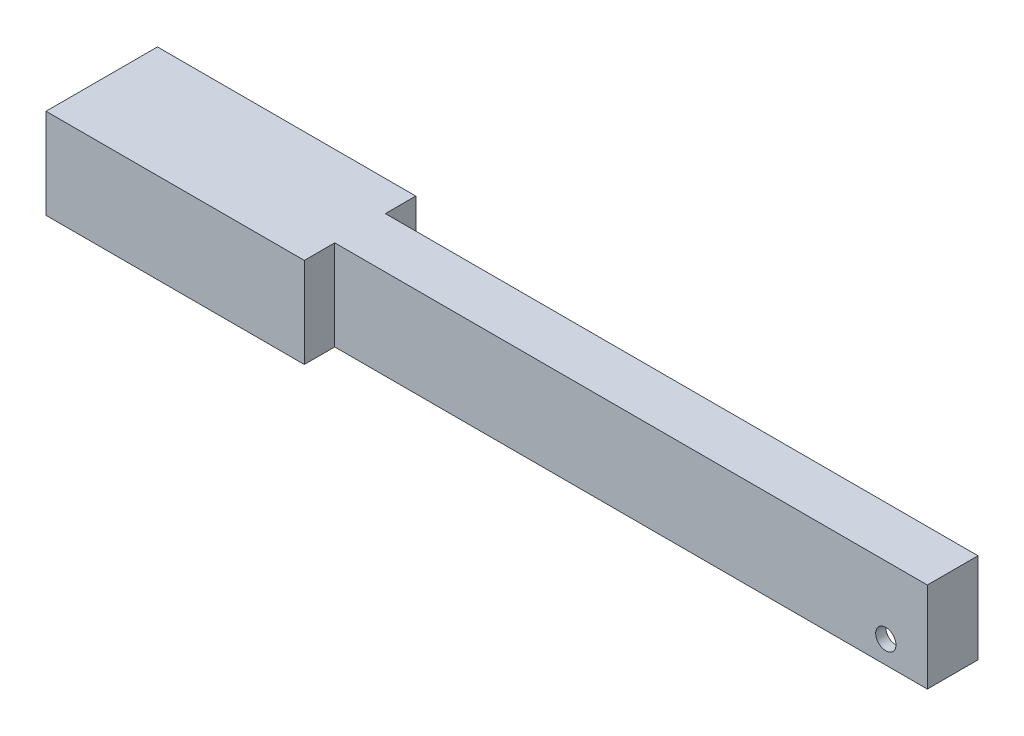
ISO-10303-21;
HEADER;
FILE_DESCRIPTION(('STEP AP214'),'2;1');
FILE_NAME('part.step','',(''),(''),'','','');
FILE_SCHEMA(('AUTOMOTIVE_DESIGN { 1 0 10303 214 1 1 1 1 }'));
ENDSEC;
DATA;
#1=APPLICATION_CONTEXT('core data for automotive mechanical design processes');
#2=APPLICATION_PROTOCOL_DEFINITION('international standard','automotive_design',2000,#1);
#3=PRODUCT_CONTEXT('',#1,'mechanical');
#4=PRODUCT('Part','Part','',(#3));
#5=PRODUCT_RELATED_PRODUCT_CATEGORY('part','',(#4));
#6=PRODUCT_DEFINITION_FORMATION('','',#4);
#7=PRODUCT_DEFINITION_CONTEXT('part definition',#1,'design');
#8=PRODUCT_DEFINITION('design','',#6,#7);
#9=PRODUCT_DEFINITION_SHAPE('','',#8);
#10=(LENGTH_UNIT() NAMED_UNIT(*) SI_UNIT(.MILLI.,.METRE.));
#11=(NAMED_UNIT(*) PLANE_ANGLE_UNIT() SI_UNIT($,.RADIAN.));
#12=(NAMED_UNIT(*) SI_UNIT($,.STERADIAN.) SOLID_ANGLE_UNIT());
#13=UNCERTAINTY_MEASURE_WITH_UNIT(LENGTH_MEASURE(1.E-05),#10,'distance_accuracy_value','');
#14=(GEOMETRIC_REPRESENTATION_CONTEXT(3) GLOBAL_UNCERTAINTY_ASSIGNED_CONTEXT((#13)) GLOBAL_UNIT_ASSIGNED_CONTEXT((#10,
#11,#12)) REPRESENTATION_CONTEXT('',''));
#15=CARTESIAN_POINT('',(0.,0.,0.));
#16=DIRECTION('',(0.,0.,1.));
#17=DIRECTION('',(1.,0.,0.));
#18=AXIS2_PLACEMENT_3D('',#15,#16,#17);
#19=CARTESIAN_POINT('',(-82.,164.984847789123,8.99999999999999));
#20=DIRECTION('',(-1.,0.,0.));
#21=DIRECTION('',(0.,0.,1.));
#22=AXIS2_PLACEMENT_3D('',#19,#20,#21);
#23=PLANE('',#22);
#24=DIRECTION('',(0.,0.,-1.));
#25=VECTOR('',#24,1.);
#26=CARTESIAN_POINT('',(-82.,-14.3,56.0425339453563));
#27=LINE('',#26,#25);
#28=CARTESIAN_POINT('',(-82.,-14.3,8.99999999999999));
#29=VERTEX_POINT('',#28);
#30=CARTESIAN_POINT('',(-82.,-14.3,-9.));
#31=VERTEX_POINT('',#30);
#32=EDGE_CURVE('E230',#29,#31,#27,.T.);
#33=ORIENTED_EDGE('',*,*,#32,.F.);
#34=DIRECTION('',(0.,-1.,0.));
#35=VECTOR('',#34,1.);
#36=CARTESIAN_POINT('',(-82.,164.984847789123,8.99999999999999));
#37=LINE('',#36,#35);
#38=CARTESIAN_POINT('',(-82.,-17.8,8.99999999999999));
#39=VERTEX_POINT('',#38);
#40=EDGE_CURVE('E272',#29,#39,#37,.T.);
#41=ORIENTED_EDGE('',*,*,#40,.T.);
#42=DIRECTION('',(0.,0.,-1.));
#43=VECTOR('',#42,1.);
#44=CARTESIAN_POINT('',(-82.,-17.8,8.99999999999999));
#45=LINE('',#44,#43);
#46=CARTESIAN_POINT('',(-82.,-17.8,-9.));
#47=VERTEX_POINT('',#46);
#48=EDGE_CURVE('E263',#39,#47,#45,.T.);
#49=ORIENTED_EDGE('',*,*,#48,.T.);
#50=DIRECTION('',(0.,-1.,0.));
#51=VECTOR('',#50,1.);
#52=CARTESIAN_POINT('',(-82.,164.984847789123,-9.));
#53=LINE('',#52,#51);
#54=EDGE_CURVE('E270',#31,#47,#53,.T.);
#55=ORIENTED_EDGE('',*,*,#54,.F.);
#56=EDGE_LOOP('',(#33,#41,#49,#55));
#57=FACE_BOUND('',#56,.T.);
#58=ADVANCED_FACE('F44',(#57),#23,.F.);
#59=DIRECTION('',(0.,0.,-1.));
#60=VECTOR('',#59,1.);
#61=CARTESIAN_POINT('',(-82.,-12.3,56.0425339453563));
#62=LINE('',#61,#60);
#63=CARTESIAN_POINT('',(-82.,-12.3,8.99999999999999));
#64=VERTEX_POINT('',#63);
#65=CARTESIAN_POINT('',(-82.,-12.3,-9.));
#66=VERTEX_POINT('',#65);
#67=EDGE_CURVE('E69',#64,#66,#62,.T.);
#68=ORIENTED_EDGE('',*,*,#67,.T.);
#69=CARTESIAN_POINT('',(-82.,-2.,-9.));
#70=VERTEX_POINT('',#69);
#71=EDGE_CURVE('E296',#70,#66,#53,.T.);
#72=ORIENTED_EDGE('',*,*,#71,.F.);
#73=DIRECTION('',(0.,0.,-1.));
#74=VECTOR('',#73,1.);
#75=CARTESIAN_POINT('',(-82.,-2.,8.99999999999999));
#76=LINE('',#75,#74);
#77=CARTESIAN_POINT('',(-82.,-2.,8.99999999999999));
#78=VERTEX_POINT('',#77);
#79=EDGE_CURVE('E247',#78,#70,#76,.T.);
#80=ORIENTED_EDGE('',*,*,#79,.F.);
#81=EDGE_CURVE('E306',#78,#64,#37,.T.);
#82=ORIENTED_EDGE('',*,*,#81,.T.);
#83=EDGE_LOOP('',(#68,#72,#80,#82));
#84=FACE_BOUND('',#83,.T.);
#85=ADVANCED_FACE('F397',(#84),#23,.F.);
#86=CARTESIAN_POINT('',(-82.,164.984847789123,-9.));
#87=DIRECTION('',(0.,0.,-1.));
#88=DIRECTION('',(-1.,0.,0.));
#89=AXIS2_PLACEMENT_3D('',#86,#87,#88);
#90=PLANE('',#89);
#91=DIRECTION('',(1.,0.,0.));
#92=VECTOR('',#91,1.);
#93=CARTESIAN_POINT('',(-82.,-14.3,-9.));
#94=LINE('',#93,#92);
#95=CARTESIAN_POINT('',(-35.,-14.3,-9.));
#96=VERTEX_POINT('',#95);
#97=EDGE_CURVE('E61',#31,#96,#94,.T.);
#98=ORIENTED_EDGE('',*,*,#97,.F.);
#99=ORIENTED_EDGE('',*,*,#54,.T.);
#100=DIRECTION('',(1.,0.,0.));
#101=VECTOR('',#100,1.);
#102=CARTESIAN_POINT('',(-82.,-17.8,-9.));
#103=LINE('',#102,#101);
#104=CARTESIAN_POINT('',(-35.,-17.8,-9.));
#105=VERTEX_POINT('',#104);
#106=EDGE_CURVE('E260',#47,#105,#103,.T.);
#107=ORIENTED_EDGE('',*,*,#106,.T.);
#108=DIRECTION('',(0.,-1.,0.));
#109=VECTOR('',#108,1.);
#110=CARTESIAN_POINT('',(-35.,164.984847789123,-9.));
#111=LINE('',#110,#109);
#112=EDGE_CURVE('E295',#96,#105,#111,.T.);
#113=ORIENTED_EDGE('',*,*,#112,.F.);
#114=EDGE_LOOP('',(#98,#99,#107,#113));
#115=FACE_BOUND('',#114,.T.);
#116=ADVANCED_FACE('F403',(#115),#90,.F.);
#117=DIRECTION('',(-1.,0.,0.));
#118=VECTOR('',#117,1.);
#119=CARTESIAN_POINT('',(-82.,-12.3,-9.));
#120=LINE('',#119,#118);
#121=CARTESIAN_POINT('',(-35.,-12.3,-9.));
#122=VERTEX_POINT('',#121);
#123=EDGE_CURVE('E217',#122,#66,#120,.T.);
#124=ORIENTED_EDGE('',*,*,#123,.F.);
#125=CARTESIAN_POINT('',(-35.,-2.,-9.));
#126=VERTEX_POINT('',#125);
#127=EDGE_CURVE('E292',#126,#122,#111,.T.);
#128=ORIENTED_EDGE('',*,*,#127,.F.);
#129=DIRECTION('',(1.,0.,0.));
#130=VECTOR('',#129,1.);
#131=CARTESIAN_POINT('',(-82.,-2.,-9.));
#132=LINE('',#131,#130);
#133=EDGE_CURVE('E293',#70,#126,#132,.T.);
#134=ORIENTED_EDGE('',*,*,#133,.F.);
#135=ORIENTED_EDGE('',*,*,#71,.T.);
#136=EDGE_LOOP('',(#124,#128,#134,#135));
#137=FACE_BOUND('',#136,.T.);
#138=ADVANCED_FACE('F526',(#137),#90,.F.);
#139=CARTESIAN_POINT('',(-35.,164.984847789123,-9.));
#140=DIRECTION('',(1.,0.,0.));
#141=DIRECTION('',(0.,0.,-1.));
#142=AXIS2_PLACEMENT_3D('',#139,#140,#141);
#143=PLANE('',#142);
#144=DIRECTION('',(0.,0.,-1.));
#145=VECTOR('',#144,1.);
#146=CARTESIAN_POINT('',(-35.,-14.3,56.0425339453563));
#147=LINE('',#146,#145);
#148=CARTESIAN_POINT('',(-35.,-14.3,-3.));
#149=VERTEX_POINT('',#148);
#150=EDGE_CURVE('E235',#149,#96,#147,.T.);
#151=ORIENTED_EDGE('',*,*,#150,.T.);
#152=ORIENTED_EDGE('',*,*,#112,.T.);
#153=DIRECTION('',(0.,0.,1.));
#154=VECTOR('',#153,1.);
#155=CARTESIAN_POINT('',(-35.,-17.8,-9.));
#156=LINE('',#155,#154);
#157=CARTESIAN_POINT('',(-35.,-17.8,-3.));
#158=VERTEX_POINT('',#157);
#159=EDGE_CURVE('E257',#105,#158,#156,.T.);
#160=ORIENTED_EDGE('',*,*,#159,.T.);
#161=DIRECTION('',(0.,-1.,0.));
#162=VECTOR('',#161,1.);
#163=CARTESIAN_POINT('',(-35.,164.984847789123,-3.));
#164=LINE('',#163,#162);
#165=EDGE_CURVE('E291',#149,#158,#164,.T.);
#166=ORIENTED_EDGE('',*,*,#165,.F.);
#167=EDGE_LOOP('',(#151,#152,#160,#166));
#168=FACE_BOUND('',#167,.T.);
#169=ADVANCED_FACE('F521',(#168),#143,.F.);
#170=DIRECTION('',(0.,0.,-1.));
#171=VECTOR('',#170,1.);
#172=CARTESIAN_POINT('',(-35.,-12.3,56.0425339453563));
#173=LINE('',#172,#171);
#174=CARTESIAN_POINT('',(-35.,-12.3,-3.));
#175=VERTEX_POINT('',#174);
#176=EDGE_CURVE('E220',#175,#122,#173,.T.);
#177=ORIENTED_EDGE('',*,*,#176,.F.);
#178=CARTESIAN_POINT('',(-35.,-2.,-3.));
#179=VERTEX_POINT('',#178);
#180=EDGE_CURVE('E287',#179,#175,#164,.T.);
#181=ORIENTED_EDGE('',*,*,#180,.F.);
#182=DIRECTION('',(0.,0.,1.));
#183=VECTOR('',#182,1.);
#184=CARTESIAN_POINT('',(-35.,-2.,-9.));
#185=LINE('',#184,#183);
#186=EDGE_CURVE('E288',#126,#179,#185,.T.);
#187=ORIENTED_EDGE('',*,*,#186,.F.);
#188=ORIENTED_EDGE('',*,*,#127,.T.);
#189=EDGE_LOOP('',(#177,#181,#187,#188));
#190=FACE_BOUND('',#189,.T.);
#191=ADVANCED_FACE('F489',(#190),#143,.F.);
#192=CARTESIAN_POINT('',(-35.,164.984847789123,8.99999999999999));
#193=DIRECTION('',(1.,0.,0.));
#194=DIRECTION('',(0.,0.,-1.));
#195=AXIS2_PLACEMENT_3D('',#192,#193,#194);
#196=PLANE('',#195);
#197=CARTESIAN_POINT('',(-35.,-14.3,8.99999999999999));
#198=VERTEX_POINT('',#197);
#199=CARTESIAN_POINT('',(-35.,-14.3,3.));
#200=VERTEX_POINT('',#199);
#201=EDGE_CURVE('E233',#198,#200,#147,.T.);
#202=ORIENTED_EDGE('',*,*,#201,.T.);
#203=DIRECTION('',(0.,-1.,0.));
#204=VECTOR('',#203,1.);
#205=CARTESIAN_POINT('',(-35.,164.984847789123,3.));
#206=LINE('',#205,#204);
#207=CARTESIAN_POINT('',(-35.,-17.8,3.));
#208=VERTEX_POINT('',#207);
#209=EDGE_CURVE('E278',#200,#208,#206,.T.);
#210=ORIENTED_EDGE('',*,*,#209,.T.);
#211=DIRECTION('',(0.,0.,1.));
#212=VECTOR('',#211,1.);
#213=CARTESIAN_POINT('',(-35.,-17.8,8.99999999999999));
#214=LINE('',#213,#212);
#215=CARTESIAN_POINT('',(-35.,-17.8,8.99999999999999));
#216=VERTEX_POINT('',#215);
#217=EDGE_CURVE('E244',#208,#216,#214,.T.);
#218=ORIENTED_EDGE('',*,*,#217,.T.);
#219=DIRECTION('',(0.,-1.,0.));
#220=VECTOR('',#219,1.);
#221=CARTESIAN_POINT('',(-35.,164.984847789123,8.99999999999999));
#222=LINE('',#221,#220);
#223=EDGE_CURVE('E206',#198,#216,#222,.T.);
#224=ORIENTED_EDGE('',*,*,#223,.F.);
#225=EDGE_LOOP('',(#202,#210,#218,#224));
#226=FACE_BOUND('',#225,.T.);
#227=ADVANCED_FACE('F487',(#226),#196,.F.);
#228=CARTESIAN_POINT('',(-35.,-12.3,8.99999999999999));
#229=VERTEX_POINT('',#228);
#230=CARTESIAN_POINT('',(-35.,-12.3,3.));
#231=VERTEX_POINT('',#230);
#232=EDGE_CURVE('E210',#229,#231,#173,.T.);
#233=ORIENTED_EDGE('',*,*,#232,.F.);
#234=CARTESIAN_POINT('',(-35.,-2.,8.99999999999999));
#235=VERTEX_POINT('',#234);
#236=EDGE_CURVE('E196',#235,#229,#222,.T.);
#237=ORIENTED_EDGE('',*,*,#236,.F.);
#238=DIRECTION('',(0.,0.,1.));
#239=VECTOR('',#238,1.);
#240=CARTESIAN_POINT('',(-35.,-2.,8.99999999999999));
#241=LINE('',#240,#239);
#242=CARTESIAN_POINT('',(-35.,-2.,3.));
#243=VERTEX_POINT('',#242);
#244=EDGE_CURVE('E273',#243,#235,#241,.T.);
#245=ORIENTED_EDGE('',*,*,#244,.F.);
#246=EDGE_CURVE('E213',#243,#231,#206,.T.);
#247=ORIENTED_EDGE('',*,*,#246,.T.);
#248=EDGE_LOOP('',(#233,#237,#245,#247));
#249=FACE_BOUND('',#248,.T.);
#250=ADVANCED_FACE('F211',(#249),#196,.F.);
#251=CARTESIAN_POINT('',(-35.,164.984847789123,8.99999999999999));
#252=DIRECTION('',(0.,0.,1.));
#253=DIRECTION('',(1.,0.,0.));
#254=AXIS2_PLACEMENT_3D('',#251,#252,#253);
#255=PLANE('',#254);
#256=DIRECTION('',(1.,0.,0.));
#257=VECTOR('',#256,1.);
#258=CARTESIAN_POINT('',(-82.,-14.3,8.99999999999999));
#259=LINE('',#258,#257);
#260=EDGE_CURVE('E223',#29,#198,#259,.T.);
#261=ORIENTED_EDGE('',*,*,#260,.T.);
#262=ORIENTED_EDGE('',*,*,#223,.T.);
#263=DIRECTION('',(-1.,0.,0.));
#264=VECTOR('',#263,1.);
#265=CARTESIAN_POINT('',(-35.,-17.8,8.99999999999999));
#266=LINE('',#265,#264);
#267=EDGE_CURVE('E243',#216,#39,#266,.T.);
#268=ORIENTED_EDGE('',*,*,#267,.T.);
#269=ORIENTED_EDGE('',*,*,#40,.F.);
#270=EDGE_LOOP('',(#261,#262,#268,#269));
#271=FACE_BOUND('',#270,.T.);
#272=ADVANCED_FACE('F477',(#271),#255,.F.);
#273=DIRECTION('',(-1.,0.,0.));
#274=VECTOR('',#273,1.);
#275=CARTESIAN_POINT('',(-82.,-12.3,8.99999999999999));
#276=LINE('',#275,#274);
#277=EDGE_CURVE('E201',#229,#64,#276,.T.);
#278=ORIENTED_EDGE('',*,*,#277,.T.);
#279=ORIENTED_EDGE('',*,*,#81,.F.);
#280=DIRECTION('',(-1.,0.,0.));
#281=VECTOR('',#280,1.);
#282=CARTESIAN_POINT('',(-35.,-2.,8.99999999999999));
#283=LINE('',#282,#281);
#284=EDGE_CURVE('E203',#235,#78,#283,.T.);
#285=ORIENTED_EDGE('',*,*,#284,.F.);
#286=ORIENTED_EDGE('',*,*,#236,.T.);
#287=EDGE_LOOP('',(#278,#279,#285,#286));
#288=FACE_BOUND('',#287,.T.);
#289=ADVANCED_FACE('F198',(#288),#255,.F.);
#290=CARTESIAN_POINT('',(75.8000000000001,-13.35,-16.6568542494924));
#291=DIRECTION('',(0.,0.,1.));
#292=DIRECTION('',(1.,0.,0.));
#293=AXIS2_PLACEMENT_3D('',#290,#291,#292);
#294=CYLINDRICAL_SURFACE('',#293,2.);
#295=CARTESIAN_POINT('',(75.8000000000001,-13.35,-3.));
#296=DIRECTION('',(0.,0.,-1.));
#297=DIRECTION('',(-1.,0.,0.));
#298=AXIS2_PLACEMENT_3D('',#295,#296,#297);
#299=CIRCLE('',#298,2.);
#300=CARTESIAN_POINT('',(73.8000000000001,-13.35,-3.));
#301=VERTEX_POINT('',#300);
#302=EDGE_CURVE('E48',#301,#301,#299,.F.);
#303=ORIENTED_EDGE('',*,*,#302,.T.);
#304=EDGE_LOOP('',(#303));
#305=FACE_BOUND('',#304,.T.);
#306=CARTESIAN_POINT('',(75.8000000000001,-13.35,-5.));
#307=DIRECTION('',(0.,0.,1.));
#308=DIRECTION('',(1.,0.,0.));
#309=AXIS2_PLACEMENT_3D('',#306,#307,#308);
#310=CIRCLE('',#309,2.);
#311=CARTESIAN_POINT('',(77.8000000000001,-13.35,-5.));
#312=VERTEX_POINT('',#311);
#313=EDGE_CURVE('E358',#312,#312,#310,.F.);
#314=ORIENTED_EDGE('',*,*,#313,.T.);
#315=EDGE_LOOP('',(#314));
#316=FACE_BOUND('',#315,.T.);
#317=ADVANCED_FACE('F376',(#305,#316),#294,.F.);
#318=CARTESIAN_POINT('',(-84.,-17.8,11.));
#319=DIRECTION('',(0.,0.,1.));
#320=DIRECTION('',(1.,0.,0.));
#321=AXIS2_PLACEMENT_3D('',#318,#319,#320);
#322=PLANE('',#321);
#323=DIRECTION('',(0.,1.,0.));
#324=VECTOR('',#323,1.);
#325=CARTESIAN_POINT('',(-33.,-134.9537451386,11.));
#326=LINE('',#325,#324);
#327=CARTESIAN_POINT('',(-33.,-17.8,11.));
#328=VERTEX_POINT('',#327);
#329=CARTESIAN_POINT('',(-33.,0.,11.));
#330=VERTEX_POINT('',#329);
#331=EDGE_CURVE('E335',#328,#330,#326,.T.);
#332=ORIENTED_EDGE('',*,*,#331,.T.);
#333=DIRECTION('',(1.,0.,0.));
#334=VECTOR('',#333,1.);
#335=CARTESIAN_POINT('',(-84.,0.,11.));
#336=LINE('',#335,#334);
#337=CARTESIAN_POINT('',(-84.,0.,11.));
#338=VERTEX_POINT('',#337);
#339=EDGE_CURVE('E354',#338,#330,#336,.T.);
#340=ORIENTED_EDGE('',*,*,#339,.F.);
#341=DIRECTION('',(0.,1.,0.));
#342=VECTOR('',#341,1.);
#343=CARTESIAN_POINT('',(-84.,-17.8,11.));
#344=LINE('',#343,#342);
#345=CARTESIAN_POINT('',(-84.,-17.8,11.));
#346=VERTEX_POINT('',#345);
#347=EDGE_CURVE('E12',#346,#338,#344,.T.);
#348=ORIENTED_EDGE('',*,*,#347,.F.);
#349=DIRECTION('',(1.,0.,0.));
#350=VECTOR('',#349,1.);
#351=CARTESIAN_POINT('',(-84.,-17.8,11.));
#352=LINE('',#351,#350);
#353=EDGE_CURVE('E342',#346,#328,#352,.T.);
#354=ORIENTED_EDGE('',*,*,#353,.T.);
#355=EDGE_LOOP('',(#332,#340,#348,#354));
#356=FACE_BOUND('',#355,.T.);
#357=ADVANCED_FACE('F46',(#356),#322,.T.);
#358=CARTESIAN_POINT('',(-84.,-17.8,11.));
#359=DIRECTION('',(1.,0.,0.));
#360=DIRECTION('',(0.,0.,-1.));
#361=AXIS2_PLACEMENT_3D('',#358,#359,#360);
#362=PLANE('',#361);
#363=DIRECTION('',(0.,0.,-1.));
#364=VECTOR('',#363,1.);
#365=CARTESIAN_POINT('',(-84.,0.,11.));
#366=LINE('',#365,#364);
#367=CARTESIAN_POINT('',(-84.,0.,-11.));
#368=VERTEX_POINT('',#367);
#369=EDGE_CURVE('E346',#338,#368,#366,.T.);
#370=ORIENTED_EDGE('',*,*,#369,.T.);
#371=DIRECTION('',(0.,1.,0.));
#372=VECTOR('',#371,1.);
#373=CARTESIAN_POINT('',(-84.,-17.8,-11.));
#374=LINE('',#373,#372);
#375=CARTESIAN_POINT('',(-84.,-17.8,-11.));
#376=VERTEX_POINT('',#375);
#377=EDGE_CURVE('E53',#376,#368,#374,.T.);
#378=ORIENTED_EDGE('',*,*,#377,.F.);
#379=DIRECTION('',(0.,0.,-1.));
#380=VECTOR('',#379,1.);
#381=CARTESIAN_POINT('',(-84.,-17.8,11.));
#382=LINE('',#381,#380);
#383=EDGE_CURVE('E352',#346,#376,#382,.T.);
#384=ORIENTED_EDGE('',*,*,#383,.F.);
#385=ORIENTED_EDGE('',*,*,#347,.T.);
#386=EDGE_LOOP('',(#370,#378,#384,#385));
#387=FACE_BOUND('',#386,.T.);
#388=ADVANCED_FACE('F434',(#387),#362,.F.);
#389=CARTESIAN_POINT('',(-84.,-17.8,-11.));
#390=DIRECTION('',(0.,0.,1.));
#391=DIRECTION('',(1.,0.,0.));
#392=AXIS2_PLACEMENT_3D('',#389,#390,#391);
#393=PLANE('',#392);
#394=DIRECTION('',(1.,0.,0.));
#395=VECTOR('',#394,1.);
#396=CARTESIAN_POINT('',(-84.,0.,-11.));
#397=LINE('',#396,#395);
#398=CARTESIAN_POINT('',(-33.,0.,-11.));
#399=VERTEX_POINT('',#398);
#400=EDGE_CURVE('E361',#368,#399,#397,.T.);
#401=ORIENTED_EDGE('',*,*,#400,.T.);
#402=DIRECTION('',(0.,1.,0.));
#403=VECTOR('',#402,1.);
#404=CARTESIAN_POINT('',(-33.,-134.9537451386,-11.));
#405=LINE('',#404,#403);
#406=CARTESIAN_POINT('',(-33.,-17.8,-11.));
#407=VERTEX_POINT('',#406);
#408=EDGE_CURVE('E321',#407,#399,#405,.T.);
#409=ORIENTED_EDGE('',*,*,#408,.F.);
#410=DIRECTION('',(1.,0.,0.));
#411=VECTOR('',#410,1.);
#412=CARTESIAN_POINT('',(-84.,-17.8,-11.));
#413=LINE('',#412,#411);
#414=EDGE_CURVE('E349',#376,#407,#413,.T.);
#415=ORIENTED_EDGE('',*,*,#414,.F.);
#416=ORIENTED_EDGE('',*,*,#377,.T.);
#417=EDGE_LOOP('',(#401,#409,#415,#416));
#418=FACE_BOUND('',#417,.T.);
#419=ADVANCED_FACE('F437',(#418),#393,.F.);
#420=CARTESIAN_POINT('',(84.,-17.8,11.));
#421=DIRECTION('',(1.,0.,0.));
#422=DIRECTION('',(0.,0.,-1.));
#423=AXIS2_PLACEMENT_3D('',#420,#421,#422);
#424=PLANE('',#423);
#425=DIRECTION('',(0.,1.,0.));
#426=VECTOR('',#425,1.);
#427=CARTESIAN_POINT('',(84.,-134.9537451386,-5.));
#428=LINE('',#427,#426);
#429=CARTESIAN_POINT('',(84.,-17.8,-5.));
#430=VERTEX_POINT('',#429);
#431=CARTESIAN_POINT('',(84.,0.,-5.));
#432=VERTEX_POINT('',#431);
#433=EDGE_CURVE('E312',#430,#432,#428,.T.);
#434=ORIENTED_EDGE('',*,*,#433,.T.);
#435=DIRECTION('',(0.,0.,-1.));
#436=VECTOR('',#435,1.);
#437=CARTESIAN_POINT('',(84.,0.,11.));
#438=LINE('',#437,#436);
#439=CARTESIAN_POINT('',(84.,0.,5.));
#440=VERTEX_POINT('',#439);
#441=EDGE_CURVE('E357',#440,#432,#438,.T.);
#442=ORIENTED_EDGE('',*,*,#441,.F.);
#443=DIRECTION('',(0.,1.,0.));
#444=VECTOR('',#443,1.);
#445=CARTESIAN_POINT('',(84.,-134.9537451386,5.));
#446=LINE('',#445,#444);
#447=CARTESIAN_POINT('',(84.,-17.8,5.));
#448=VERTEX_POINT('',#447);
#449=EDGE_CURVE('E330',#448,#440,#446,.T.);
#450=ORIENTED_EDGE('',*,*,#449,.F.);
#451=DIRECTION('',(0.,0.,-1.));
#452=VECTOR('',#451,1.);
#453=CARTESIAN_POINT('',(84.,-17.8,11.));
#454=LINE('',#453,#452);
#455=EDGE_CURVE('E345',#448,#430,#454,.T.);
#456=ORIENTED_EDGE('',*,*,#455,.T.);
#457=EDGE_LOOP('',(#434,#442,#450,#456));
#458=FACE_BOUND('',#457,.T.);
#459=ADVANCED_FACE('F429',(#458),#424,.T.);
#460=CARTESIAN_POINT('',(0.,-17.8,0.));
#461=DIRECTION('',(0.,1.,0.));
#462=DIRECTION('',(0.,0.,1.));
#463=AXIS2_PLACEMENT_3D('',#460,#461,#462);
#464=PLANE('',#463);
#465=ORIENTED_EDGE('',*,*,#106,.F.);
#466=ORIENTED_EDGE('',*,*,#48,.F.);
#467=ORIENTED_EDGE('',*,*,#267,.F.);
#468=ORIENTED_EDGE('',*,*,#217,.F.);
#469=DIRECTION('',(-1.,0.,0.));
#470=VECTOR('',#469,1.);
#471=CARTESIAN_POINT('',(-35.,-17.8,3.));
#472=LINE('',#471,#470);
#473=CARTESIAN_POINT('',(82.,-17.8,3.));
#474=VERTEX_POINT('',#473);
#475=EDGE_CURVE('E248',#474,#208,#472,.T.);
#476=ORIENTED_EDGE('',*,*,#475,.F.);
#477=DIRECTION('',(0.,0.,1.));
#478=VECTOR('',#477,1.);
#479=CARTESIAN_POINT('',(82.,-17.8,3.));
#480=LINE('',#479,#478);
#481=CARTESIAN_POINT('',(82.,-17.8,-3.));
#482=VERTEX_POINT('',#481);
#483=EDGE_CURVE('E251',#482,#474,#480,.T.);
#484=ORIENTED_EDGE('',*,*,#483,.F.);
#485=DIRECTION('',(1.,0.,0.));
#486=VECTOR('',#485,1.);
#487=CARTESIAN_POINT('',(-35.,-17.8,-3.));
#488=LINE('',#487,#486);
#489=EDGE_CURVE('E254',#158,#482,#488,.T.);
#490=ORIENTED_EDGE('',*,*,#489,.F.);
#491=ORIENTED_EDGE('',*,*,#159,.F.);
#492=EDGE_LOOP('',(#465,#466,#467,#468,#476,#484,#490,#491));
#493=FACE_BOUND('',#492,.T.);
#494=DIRECTION('',(0.,0.,-1.));
#495=VECTOR('',#494,1.);
#496=CARTESIAN_POINT('',(-33.,-17.8,-11.));
#497=LINE('',#496,#495);
#498=CARTESIAN_POINT('',(-33.,-17.8,-5.));
#499=VERTEX_POINT('',#498);
#500=EDGE_CURVE('E309',#499,#407,#497,.T.);
#501=ORIENTED_EDGE('',*,*,#500,.F.);
#502=DIRECTION('',(-1.,0.,0.));
#503=VECTOR('',#502,1.);
#504=CARTESIAN_POINT('',(-33.,-17.8,-5.));
#505=LINE('',#504,#503);
#506=EDGE_CURVE('E311',#430,#499,#505,.T.);
#507=ORIENTED_EDGE('',*,*,#506,.F.);
#508=ORIENTED_EDGE('',*,*,#455,.F.);
#509=DIRECTION('',(1.,0.,0.));
#510=VECTOR('',#509,1.);
#511=CARTESIAN_POINT('',(-33.,-17.8,5.));
#512=LINE('',#511,#510);
#513=CARTESIAN_POINT('',(-33.,-17.8,5.));
#514=VERTEX_POINT('',#513);
#515=EDGE_CURVE('E327',#514,#448,#512,.T.);
#516=ORIENTED_EDGE('',*,*,#515,.F.);
#517=DIRECTION('',(0.,0.,-1.));
#518=VECTOR('',#517,1.);
#519=CARTESIAN_POINT('',(-33.,-17.8,11.));
#520=LINE('',#519,#518);
#521=EDGE_CURVE('E329',#328,#514,#520,.T.);
#522=ORIENTED_EDGE('',*,*,#521,.F.);
#523=ORIENTED_EDGE('',*,*,#353,.F.);
#524=ORIENTED_EDGE('',*,*,#383,.T.);
#525=ORIENTED_EDGE('',*,*,#414,.T.);
#526=EDGE_LOOP('',(#501,#507,#508,#516,#522,#523,#524,#525));
#527=FACE_BOUND('',#526,.T.);
#528=ADVANCED_FACE('F426',(#493,#527),#464,.F.);
#529=CARTESIAN_POINT('',(0.,0.,0.));
#530=DIRECTION('',(0.,1.,0.));
#531=DIRECTION('',(0.,0.,1.));
#532=AXIS2_PLACEMENT_3D('',#529,#530,#531);
#533=PLANE('',#532);
#534=DIRECTION('',(1.,0.,0.));
#535=VECTOR('',#534,1.);
#536=CARTESIAN_POINT('',(-33.,0.,-5.));
#537=LINE('',#536,#535);
#538=CARTESIAN_POINT('',(-33.,0.,-5.));
#539=VERTEX_POINT('',#538);
#540=EDGE_CURVE('E318',#539,#432,#537,.T.);
#541=ORIENTED_EDGE('',*,*,#540,.F.);
#542=DIRECTION('',(0.,0.,1.));
#543=VECTOR('',#542,1.);
#544=CARTESIAN_POINT('',(-33.,0.,-11.));
#545=LINE('',#544,#543);
#546=EDGE_CURVE('E315',#399,#539,#545,.T.);
#547=ORIENTED_EDGE('',*,*,#546,.F.);
#548=ORIENTED_EDGE('',*,*,#400,.F.);
#549=ORIENTED_EDGE('',*,*,#369,.F.);
#550=ORIENTED_EDGE('',*,*,#339,.T.);
#551=DIRECTION('',(0.,0.,1.));
#552=VECTOR('',#551,1.);
#553=CARTESIAN_POINT('',(-33.,0.,11.));
#554=LINE('',#553,#552);
#555=CARTESIAN_POINT('',(-33.,0.,5.));
#556=VERTEX_POINT('',#555);
#557=EDGE_CURVE('E332',#556,#330,#554,.T.);
#558=ORIENTED_EDGE('',*,*,#557,.F.);
#559=DIRECTION('',(-1.,0.,0.));
#560=VECTOR('',#559,1.);
#561=CARTESIAN_POINT('',(-33.,0.,5.));
#562=LINE('',#561,#560);
#563=EDGE_CURVE('E319',#440,#556,#562,.T.);
#564=ORIENTED_EDGE('',*,*,#563,.F.);
#565=ORIENTED_EDGE('',*,*,#441,.T.);
#566=EDGE_LOOP('',(#541,#547,#548,#549,#550,#558,#564,#565));
#567=FACE_BOUND('',#566,.T.);
#568=ADVANCED_FACE('F421',(#567),#533,.T.);
#569=CARTESIAN_POINT('',(-33.,-134.9537451386,5.));
#570=DIRECTION('',(0.,0.,-1.));
#571=DIRECTION('',(-1.,0.,0.));
#572=AXIS2_PLACEMENT_3D('',#569,#570,#571);
#573=PLANE('',#572);
#574=ORIENTED_EDGE('',*,*,#515,.T.);
#575=ORIENTED_EDGE('',*,*,#449,.T.);
#576=ORIENTED_EDGE('',*,*,#563,.T.);
#577=DIRECTION('',(0.,1.,0.));
#578=VECTOR('',#577,1.);
#579=CARTESIAN_POINT('',(-33.,-134.9537451386,5.));
#580=LINE('',#579,#578);
#581=EDGE_CURVE('E333',#514,#556,#580,.T.);
#582=ORIENTED_EDGE('',*,*,#581,.F.);
#583=EDGE_LOOP('',(#574,#575,#576,#582));
#584=FACE_BOUND('',#583,.T.);
#585=CARTESIAN_POINT('',(75.8000000000001,-13.35,5.));
#586=DIRECTION('',(0.,0.,-1.));
#587=DIRECTION('',(-1.,0.,0.));
#588=AXIS2_PLACEMENT_3D('',#585,#586,#587);
#589=CIRCLE('',#588,2.);
#590=CARTESIAN_POINT('',(73.8000000000001,-13.35,5.));
#591=VERTEX_POINT('',#590);
#592=EDGE_CURVE('E314',#591,#591,#589,.F.);
#593=ORIENTED_EDGE('',*,*,#592,.F.);
#594=EDGE_LOOP('',(#593));
#595=FACE_BOUND('',#594,.T.);
#596=ADVANCED_FACE('F418',(#584,#595),#573,.F.);
#597=CARTESIAN_POINT('',(-33.,-134.9537451386,11.));
#598=DIRECTION('',(-1.,0.,0.));
#599=DIRECTION('',(0.,0.,1.));
#600=AXIS2_PLACEMENT_3D('',#597,#598,#599);
#601=PLANE('',#600);
#602=ORIENTED_EDGE('',*,*,#521,.T.);
#603=ORIENTED_EDGE('',*,*,#581,.T.);
#604=ORIENTED_EDGE('',*,*,#557,.T.);
#605=ORIENTED_EDGE('',*,*,#331,.F.);
#606=EDGE_LOOP('',(#602,#603,#604,#605));
#607=FACE_BOUND('',#606,.T.);
#608=ADVANCED_FACE('F413',(#607),#601,.F.);
#609=CARTESIAN_POINT('',(-33.,-134.9537451386,-5.));
#610=DIRECTION('',(0.,0.,1.));
#611=DIRECTION('',(1.,0.,0.));
#612=AXIS2_PLACEMENT_3D('',#609,#610,#611);
#613=PLANE('',#612);
#614=ORIENTED_EDGE('',*,*,#506,.T.);
#615=DIRECTION('',(0.,1.,0.));
#616=VECTOR('',#615,1.);
#617=CARTESIAN_POINT('',(-33.,-134.9537451386,-5.));
#618=LINE('',#617,#616);
#619=EDGE_CURVE('E324',#499,#539,#618,.T.);
#620=ORIENTED_EDGE('',*,*,#619,.T.);
#621=ORIENTED_EDGE('',*,*,#540,.T.);
#622=ORIENTED_EDGE('',*,*,#433,.F.);
#623=EDGE_LOOP('',(#614,#620,#621,#622));
#624=FACE_BOUND('',#623,.T.);
#625=ORIENTED_EDGE('',*,*,#313,.F.);
#626=EDGE_LOOP('',(#625));
#627=FACE_BOUND('',#626,.T.);
#628=ADVANCED_FACE('F410',(#624,#627),#613,.F.);
#629=CARTESIAN_POINT('',(-33.,-134.9537451386,-11.));
#630=DIRECTION('',(-1.,0.,0.));
#631=DIRECTION('',(0.,0.,1.));
#632=AXIS2_PLACEMENT_3D('',#629,#630,#631);
#633=PLANE('',#632);
#634=ORIENTED_EDGE('',*,*,#500,.T.);
#635=ORIENTED_EDGE('',*,*,#408,.T.);
#636=ORIENTED_EDGE('',*,*,#546,.T.);
#637=ORIENTED_EDGE('',*,*,#619,.F.);
#638=EDGE_LOOP('',(#634,#635,#636,#637));
#639=FACE_BOUND('',#638,.T.);
#640=ADVANCED_FACE('F392',(#639),#633,.F.);
#641=CARTESIAN_POINT('',(75.8000000000001,-13.35,3.));
#642=DIRECTION('',(0.,0.,1.));
#643=DIRECTION('',(1.,0.,0.));
#644=AXIS2_PLACEMENT_3D('',#641,#642,#643);
#645=CIRCLE('',#644,2.);
#646=CARTESIAN_POINT('',(77.8000000000001,-13.35,3.));
#647=VERTEX_POINT('',#646);
#648=EDGE_CURVE('E308',#647,#647,#645,.F.);
#649=ORIENTED_EDGE('',*,*,#648,.T.);
#650=EDGE_LOOP('',(#649));
#651=FACE_BOUND('',#650,.T.);
#652=ORIENTED_EDGE('',*,*,#592,.T.);
#653=EDGE_LOOP('',(#652));
#654=FACE_BOUND('',#653,.T.);
#655=ADVANCED_FACE('F382',(#651,#654),#294,.F.);
#656=CARTESIAN_POINT('',(-35.,164.984847789123,-3.));
#657=DIRECTION('',(0.,0.,-1.));
#658=DIRECTION('',(-1.,0.,0.));
#659=AXIS2_PLACEMENT_3D('',#656,#657,#658);
#660=PLANE('',#659);
#661=ORIENTED_EDGE('',*,*,#180,.T.);
#662=DIRECTION('',(0.,1.,0.));
#663=VECTOR('',#662,1.);
#664=CARTESIAN_POINT('',(-35.,164.984847789123,-3.));
#665=LINE('',#664,#663);
#666=EDGE_CURVE('E240',#149,#175,#665,.T.);
#667=ORIENTED_EDGE('',*,*,#666,.F.);
#668=ORIENTED_EDGE('',*,*,#165,.T.);
#669=ORIENTED_EDGE('',*,*,#489,.T.);
#670=DIRECTION('',(0.,-1.,0.));
#671=VECTOR('',#670,1.);
#672=CARTESIAN_POINT('',(82.,164.984847789123,-3.));
#673=LINE('',#672,#671);
#674=CARTESIAN_POINT('',(82.,-2.,-3.));
#675=VERTEX_POINT('',#674);
#676=EDGE_CURVE('E283',#675,#482,#673,.T.);
#677=ORIENTED_EDGE('',*,*,#676,.F.);
#678=DIRECTION('',(1.,0.,0.));
#679=VECTOR('',#678,1.);
#680=CARTESIAN_POINT('',(-35.,-2.,-3.));
#681=LINE('',#680,#679);
#682=EDGE_CURVE('E284',#179,#675,#681,.T.);
#683=ORIENTED_EDGE('',*,*,#682,.F.);
#684=EDGE_LOOP('',(#661,#667,#668,#669,#677,#683));
#685=FACE_BOUND('',#684,.T.);
#686=ORIENTED_EDGE('',*,*,#302,.F.);
#687=EDGE_LOOP('',(#686));
#688=FACE_BOUND('',#687,.T.);
#689=ADVANCED_FACE('F379',(#685,#688),#660,.F.);
#690=CARTESIAN_POINT('',(-35.,164.984847789123,3.));
#691=DIRECTION('',(0.,0.,1.));
#692=DIRECTION('',(1.,0.,0.));
#693=AXIS2_PLACEMENT_3D('',#690,#691,#692);
#694=PLANE('',#693);
#695=DIRECTION('',(0.,-1.,0.));
#696=VECTOR('',#695,1.);
#697=CARTESIAN_POINT('',(82.,164.984847789123,3.));
#698=LINE('',#697,#696);
#699=CARTESIAN_POINT('',(82.,-2.,3.));
#700=VERTEX_POINT('',#699);
#701=EDGE_CURVE('E279',#700,#474,#698,.T.);
#702=ORIENTED_EDGE('',*,*,#701,.T.);
#703=ORIENTED_EDGE('',*,*,#475,.T.);
#704=ORIENTED_EDGE('',*,*,#209,.F.);
#705=DIRECTION('',(0.,-1.,0.));
#706=VECTOR('',#705,1.);
#707=CARTESIAN_POINT('',(-35.,164.984847789123,3.));
#708=LINE('',#707,#706);
#709=EDGE_CURVE('E225',#231,#200,#708,.T.);
#710=ORIENTED_EDGE('',*,*,#709,.F.);
#711=ORIENTED_EDGE('',*,*,#246,.F.);
#712=DIRECTION('',(-1.,0.,0.));
#713=VECTOR('',#712,1.);
#714=CARTESIAN_POINT('',(-35.,-2.,3.));
#715=LINE('',#714,#713);
#716=EDGE_CURVE('E275',#700,#243,#715,.T.);
#717=ORIENTED_EDGE('',*,*,#716,.F.);
#718=EDGE_LOOP('',(#702,#703,#704,#710,#711,#717));
#719=FACE_BOUND('',#718,.T.);
#720=ORIENTED_EDGE('',*,*,#648,.F.);
#721=EDGE_LOOP('',(#720));
#722=FACE_BOUND('',#721,.T.);
#723=ADVANCED_FACE('F381',(#719,#722),#694,.F.);
#724=CARTESIAN_POINT('',(0.,-2.,0.));
#725=DIRECTION('',(0.,1.,0.));
#726=DIRECTION('',(0.,0.,1.));
#727=AXIS2_PLACEMENT_3D('',#724,#725,#726);
#728=PLANE('',#727);
#729=ORIENTED_EDGE('',*,*,#284,.T.);
#730=ORIENTED_EDGE('',*,*,#79,.T.);
#731=ORIENTED_EDGE('',*,*,#133,.T.);
#732=ORIENTED_EDGE('',*,*,#186,.T.);
#733=ORIENTED_EDGE('',*,*,#682,.T.);
#734=DIRECTION('',(0.,0.,1.));
#735=VECTOR('',#734,1.);
#736=CARTESIAN_POINT('',(82.,-2.,3.));
#737=LINE('',#736,#735);
#738=EDGE_CURVE('E280',#675,#700,#737,.T.);
#739=ORIENTED_EDGE('',*,*,#738,.T.);
#740=ORIENTED_EDGE('',*,*,#716,.T.);
#741=ORIENTED_EDGE('',*,*,#244,.T.);
#742=EDGE_LOOP('',(#729,#730,#731,#732,#733,#739,#740,#741));
#743=FACE_BOUND('',#742,.T.);
#744=ADVANCED_FACE('F389',(#743),#728,.F.);
#745=CARTESIAN_POINT('',(82.,164.984847789123,3.));
#746=DIRECTION('',(1.,0.,0.));
#747=DIRECTION('',(0.,0.,-1.));
#748=AXIS2_PLACEMENT_3D('',#745,#746,#747);
#749=PLANE('',#748);
#750=ORIENTED_EDGE('',*,*,#676,.T.);
#751=ORIENTED_EDGE('',*,*,#483,.T.);
#752=ORIENTED_EDGE('',*,*,#701,.F.);
#753=ORIENTED_EDGE('',*,*,#738,.F.);
#754=EDGE_LOOP('',(#750,#751,#752,#753));
#755=FACE_BOUND('',#754,.T.);
#756=ADVANCED_FACE('F408',(#755),#749,.F.);
#757=CARTESIAN_POINT('',(-35.,-12.3,56.0425339453563));
#758=DIRECTION('',(-1.,0.,0.));
#759=DIRECTION('',(0.,0.,1.));
#760=AXIS2_PLACEMENT_3D('',#757,#758,#759);
#761=PLANE('',#760);
#762=EDGE_CURVE('E234',#200,#149,#147,.T.);
#763=ORIENTED_EDGE('',*,*,#762,.T.);
#764=ORIENTED_EDGE('',*,*,#666,.T.);
#765=EDGE_CURVE('E218',#231,#175,#173,.T.);
#766=ORIENTED_EDGE('',*,*,#765,.F.);
#767=ORIENTED_EDGE('',*,*,#709,.T.);
#768=EDGE_LOOP('',(#763,#764,#766,#767));
#769=FACE_BOUND('',#768,.T.);
#770=ADVANCED_FACE('F492',(#769),#761,.F.);
#771=CARTESIAN_POINT('',(-82.,-14.3,56.0425339453563));
#772=DIRECTION('',(0.,1.,0.));
#773=DIRECTION('',(0.,0.,1.));
#774=AXIS2_PLACEMENT_3D('',#771,#772,#773);
#775=PLANE('',#774);
#776=ORIENTED_EDGE('',*,*,#260,.F.);
#777=ORIENTED_EDGE('',*,*,#32,.T.);
#778=ORIENTED_EDGE('',*,*,#97,.T.);
#779=ORIENTED_EDGE('',*,*,#150,.F.);
#780=ORIENTED_EDGE('',*,*,#762,.F.);
#781=ORIENTED_EDGE('',*,*,#201,.F.);
#782=EDGE_LOOP('',(#776,#777,#778,#779,#780,#781));
#783=FACE_BOUND('',#782,.T.);
#784=ADVANCED_FACE('F485',(#783),#775,.F.);
#785=CARTESIAN_POINT('',(-82.,-12.3,56.0425339453563));
#786=DIRECTION('',(0.,-1.,0.));
#787=DIRECTION('',(0.,0.,-1.));
#788=AXIS2_PLACEMENT_3D('',#785,#786,#787);
#789=PLANE('',#788);
#790=ORIENTED_EDGE('',*,*,#277,.F.);
#791=ORIENTED_EDGE('',*,*,#232,.T.);
#792=ORIENTED_EDGE('',*,*,#765,.T.);
#793=ORIENTED_EDGE('',*,*,#176,.T.);
#794=ORIENTED_EDGE('',*,*,#123,.T.);
#795=ORIENTED_EDGE('',*,*,#67,.F.);
#796=EDGE_LOOP('',(#790,#791,#792,#793,#794,#795));
#797=FACE_BOUND('',#796,.T.);
#798=ADVANCED_FACE('F221',(#797),#789,.F.);
#799=CLOSED_SHELL('',(#58,#85,#116,#138,#169,#191,#227,#250,#272,#289,#317,#357,#388,#419,#459,
#528,#568,#596,#608,#628,#640,#655,#689,#723,#744,#756,#770,#784,#798));
#800=MANIFOLD_SOLID_BREP('B2',#799);
#801=ADVANCED_BREP_SHAPE_REPRESENTATION('',(#18,#800),#14);
#802=SHAPE_DEFINITION_REPRESENTATION(#9,#801);
ENDSEC;
END-ISO-10303-21;
